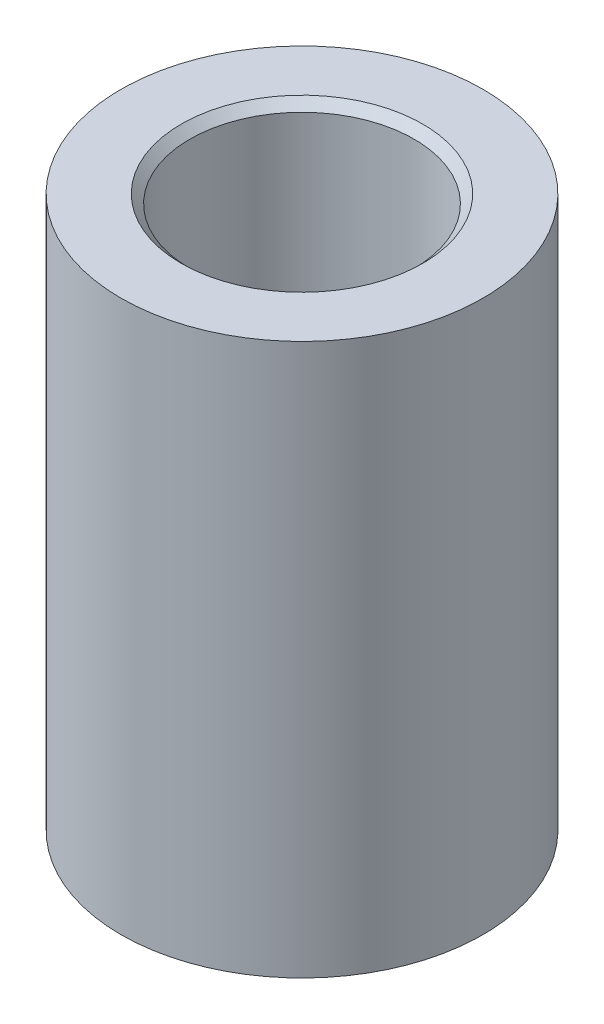
ISO-10303-21;
HEADER;
FILE_DESCRIPTION(('STEP AP214'),'2;1');
FILE_NAME('part.step','',(''),(''),'','','');
FILE_SCHEMA(('AUTOMOTIVE_DESIGN { 1 0 10303 214 1 1 1 1 }'));
ENDSEC;
DATA;
#1=APPLICATION_CONTEXT('core data for automotive mechanical design processes');
#2=APPLICATION_PROTOCOL_DEFINITION('international standard','automotive_design',2000,#1);
#3=PRODUCT_CONTEXT('',#1,'mechanical');
#4=PRODUCT('Part','Part','',(#3));
#5=PRODUCT_RELATED_PRODUCT_CATEGORY('part','',(#4));
#6=PRODUCT_DEFINITION_FORMATION('','',#4);
#7=PRODUCT_DEFINITION_CONTEXT('part definition',#1,'design');
#8=PRODUCT_DEFINITION('design','',#6,#7);
#9=PRODUCT_DEFINITION_SHAPE('','',#8);
#10=(LENGTH_UNIT() NAMED_UNIT(*) SI_UNIT(.MILLI.,.METRE.));
#11=(NAMED_UNIT(*) PLANE_ANGLE_UNIT() SI_UNIT($,.RADIAN.));
#12=(NAMED_UNIT(*) SI_UNIT($,.STERADIAN.) SOLID_ANGLE_UNIT());
#13=UNCERTAINTY_MEASURE_WITH_UNIT(LENGTH_MEASURE(1.E-05),#10,'distance_accuracy_value','');
#14=(GEOMETRIC_REPRESENTATION_CONTEXT(3) GLOBAL_UNCERTAINTY_ASSIGNED_CONTEXT((#13)) GLOBAL_UNIT_ASSIGNED_CONTEXT((#10,
#11,#12)) REPRESENTATION_CONTEXT('',''));
#15=CARTESIAN_POINT('',(0.,0.,0.));
#16=DIRECTION('',(0.,0.,1.));
#17=DIRECTION('',(1.,0.,0.));
#18=AXIS2_PLACEMENT_3D('',#15,#16,#17);
#19=CARTESIAN_POINT('',(0.,25.4,0.));
#20=DIRECTION('',(0.,1.,0.));
#21=DIRECTION('',(0.,0.,1.));
#22=AXIS2_PLACEMENT_3D('',#19,#20,#21);
#23=PLANE('',#22);
#24=CARTESIAN_POINT('',(0.,25.4,0.));
#25=DIRECTION('',(0.,1.,0.));
#26=DIRECTION('',(0.,0.,1.));
#27=AXIS2_PLACEMENT_3D('',#24,#25,#26);
#28=CIRCLE('',#27,5.5625);
#29=CARTESIAN_POINT('',(0.,25.4,5.5625));
#30=VERTEX_POINT('',#29);
#31=EDGE_CURVE('E10',#30,#30,#28,.F.);
#32=ORIENTED_EDGE('',*,*,#31,.T.);
#33=EDGE_LOOP('',(#32));
#34=FACE_BOUND('',#33,.T.);
#35=CARTESIAN_POINT('',(0.,25.4,0.));
#36=DIRECTION('',(0.,1.,0.));
#37=DIRECTION('',(0.,0.,1.));
#38=AXIS2_PLACEMENT_3D('',#35,#36,#37);
#39=CIRCLE('',#38,8.3375);
#40=CARTESIAN_POINT('',(0.,25.4,8.3375));
#41=VERTEX_POINT('',#40);
#42=EDGE_CURVE('E51',#41,#41,#39,.T.);
#43=ORIENTED_EDGE('',*,*,#42,.T.);
#44=EDGE_LOOP('',(#43));
#45=FACE_BOUND('',#44,.T.);
#46=ADVANCED_FACE('F31',(#34,#45),#23,.T.);
#47=CARTESIAN_POINT('',(0.,0.,0.));
#48=DIRECTION('',(0.,1.,0.));
#49=DIRECTION('',(0.,0.,1.));
#50=AXIS2_PLACEMENT_3D('',#47,#48,#49);
#51=PLANE('',#50);
#52=CARTESIAN_POINT('',(0.,0.,0.));
#53=DIRECTION('',(0.,1.,0.));
#54=DIRECTION('',(0.,0.,1.));
#55=AXIS2_PLACEMENT_3D('',#52,#53,#54);
#56=CIRCLE('',#55,5.56250000000001);
#57=CARTESIAN_POINT('',(0.,0.,5.56250000000001));
#58=VERTEX_POINT('',#57);
#59=EDGE_CURVE('E46',#58,#58,#56,.T.);
#60=ORIENTED_EDGE('',*,*,#59,.T.);
#61=EDGE_LOOP('',(#60));
#62=FACE_BOUND('',#61,.T.);
#63=CARTESIAN_POINT('',(0.,0.,0.));
#64=DIRECTION('',(0.,1.,0.));
#65=DIRECTION('',(0.,0.,1.));
#66=AXIS2_PLACEMENT_3D('',#63,#64,#65);
#67=CIRCLE('',#66,8.3375);
#68=CARTESIAN_POINT('',(0.,0.,8.3375));
#69=VERTEX_POINT('',#68);
#70=EDGE_CURVE('E52',#69,#69,#67,.T.);
#71=ORIENTED_EDGE('',*,*,#70,.F.);
#72=EDGE_LOOP('',(#71));
#73=FACE_BOUND('',#72,.T.);
#74=ADVANCED_FACE('F63',(#62,#73),#51,.F.);
#75=CARTESIAN_POINT('',(0.,25.4,0.));
#76=DIRECTION('',(0.,-1.,0.));
#77=DIRECTION('',(0.,0.,-1.));
#78=AXIS2_PLACEMENT_3D('',#75,#76,#77);
#79=CYLINDRICAL_SURFACE('',#78,8.3375);
#80=ORIENTED_EDGE('',*,*,#42,.F.);
#81=EDGE_LOOP('',(#80));
#82=FACE_BOUND('',#81,.T.);
#83=ORIENTED_EDGE('',*,*,#70,.T.);
#84=EDGE_LOOP('',(#83));
#85=FACE_BOUND('',#84,.T.);
#86=ADVANCED_FACE('F59',(#82,#85),#79,.T.);
#87=CARTESIAN_POINT('',(0.,25.4,0.));
#88=DIRECTION('',(0.,-1.,0.));
#89=DIRECTION('',(0.,0.,-1.));
#90=AXIS2_PLACEMENT_3D('',#87,#88,#89);
#91=CYLINDRICAL_SURFACE('',#90,5.1625);
#92=CARTESIAN_POINT('',(0.,0.400000000000005,0.));
#93=DIRECTION('',(0.,1.,0.));
#94=DIRECTION('',(0.,0.,1.));
#95=AXIS2_PLACEMENT_3D('',#92,#93,#94);
#96=CIRCLE('',#95,5.1625);
#97=CARTESIAN_POINT('',(0.,0.400000000000005,5.1625));
#98=VERTEX_POINT('',#97);
#99=EDGE_CURVE('E38',#98,#98,#96,.F.);
#100=ORIENTED_EDGE('',*,*,#99,.T.);
#101=EDGE_LOOP('',(#100));
#102=FACE_BOUND('',#101,.T.);
#103=CARTESIAN_POINT('',(0.,25.,0.));
#104=DIRECTION('',(0.,1.,0.));
#105=DIRECTION('',(0.,0.,1.));
#106=AXIS2_PLACEMENT_3D('',#103,#104,#105);
#107=CIRCLE('',#106,5.1625);
#108=CARTESIAN_POINT('',(0.,25.,5.1625));
#109=VERTEX_POINT('',#108);
#110=EDGE_CURVE('E42',#109,#109,#107,.T.);
#111=ORIENTED_EDGE('',*,*,#110,.T.);
#112=EDGE_LOOP('',(#111));
#113=FACE_BOUND('',#112,.T.);
#114=ADVANCED_FACE('F62',(#102,#113),#91,.F.);
#115=CARTESIAN_POINT('',(0.,0.,0.));
#116=DIRECTION('',(0.,-1.,0.));
#117=DIRECTION('',(0.,0.,-1.));
#118=AXIS2_PLACEMENT_3D('',#115,#116,#117);
#119=CONICAL_SURFACE('',#118,5.56250000000001,0.785398163397448);
#120=ORIENTED_EDGE('',*,*,#99,.F.);
#121=EDGE_LOOP('',(#120));
#122=FACE_BOUND('',#121,.T.);
#123=ORIENTED_EDGE('',*,*,#59,.F.);
#124=EDGE_LOOP('',(#123));
#125=FACE_BOUND('',#124,.T.);
#126=ADVANCED_FACE('F75',(#122,#125),#119,.F.);
#127=CARTESIAN_POINT('',(0.,25.,0.));
#128=DIRECTION('',(0.,1.,0.));
#129=DIRECTION('',(0.,0.,1.));
#130=AXIS2_PLACEMENT_3D('',#127,#128,#129);
#131=CONICAL_SURFACE('',#130,5.1625,0.785398163397444);
#132=ORIENTED_EDGE('',*,*,#31,.F.);
#133=EDGE_LOOP('',(#132));
#134=FACE_BOUND('',#133,.T.);
#135=ORIENTED_EDGE('',*,*,#110,.F.);
#136=EDGE_LOOP('',(#135));
#137=FACE_BOUND('',#136,.T.);
#138=ADVANCED_FACE('F33',(#134,#137),#131,.F.);
#139=CLOSED_SHELL('',(#46,#74,#86,#114,#126,#138));
#140=MANIFOLD_SOLID_BREP('B2',#139);
#141=ADVANCED_BREP_SHAPE_REPRESENTATION('',(#18,#140),#14);
#142=SHAPE_DEFINITION_REPRESENTATION(#9,#141);
ENDSEC;
END-ISO-10303-21;
